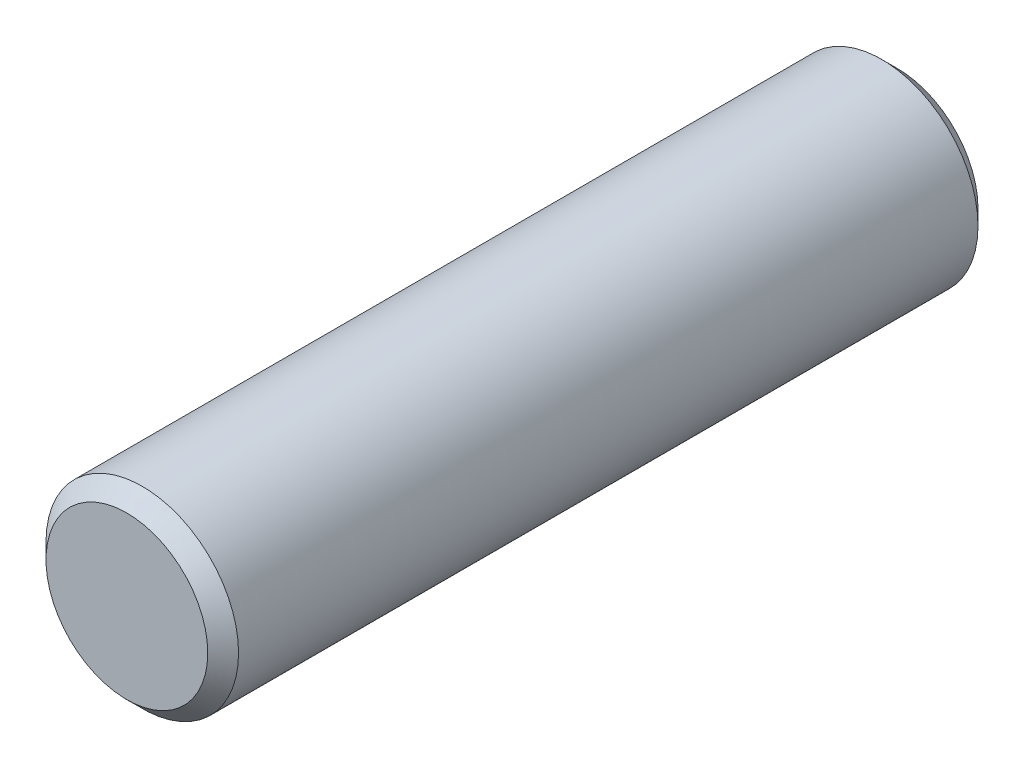
ISO-10303-21;
HEADER;
FILE_DESCRIPTION(('STEP AP214'),'2;1');
FILE_NAME('part.step','',(''),(''),'','','');
FILE_SCHEMA(('AUTOMOTIVE_DESIGN { 1 0 10303 214 1 1 1 1 }'));
ENDSEC;
DATA;
#1=APPLICATION_CONTEXT('core data for automotive mechanical design processes');
#2=APPLICATION_PROTOCOL_DEFINITION('international standard','automotive_design',2000,#1);
#3=PRODUCT_CONTEXT('',#1,'mechanical');
#4=PRODUCT('Part','Part','',(#3));
#5=PRODUCT_RELATED_PRODUCT_CATEGORY('part','',(#4));
#6=PRODUCT_DEFINITION_FORMATION('','',#4);
#7=PRODUCT_DEFINITION_CONTEXT('part definition',#1,'design');
#8=PRODUCT_DEFINITION('design','',#6,#7);
#9=PRODUCT_DEFINITION_SHAPE('','',#8);
#10=(LENGTH_UNIT() NAMED_UNIT(*) SI_UNIT(.MILLI.,.METRE.));
#11=(NAMED_UNIT(*) PLANE_ANGLE_UNIT() SI_UNIT($,.RADIAN.));
#12=(NAMED_UNIT(*) SI_UNIT($,.STERADIAN.) SOLID_ANGLE_UNIT());
#13=UNCERTAINTY_MEASURE_WITH_UNIT(LENGTH_MEASURE(1.E-05),#10,'distance_accuracy_value','');
#14=(GEOMETRIC_REPRESENTATION_CONTEXT(3) GLOBAL_UNCERTAINTY_ASSIGNED_CONTEXT((#13)) GLOBAL_UNIT_ASSIGNED_CONTEXT((#10,
#11,#12)) REPRESENTATION_CONTEXT('',''));
#15=CARTESIAN_POINT('',(0.,0.,0.));
#16=DIRECTION('',(0.,0.,1.));
#17=DIRECTION('',(1.,0.,0.));
#18=AXIS2_PLACEMENT_3D('',#15,#16,#17);
#19=CARTESIAN_POINT('',(0.,0.,20.));
#20=DIRECTION('',(0.,0.,-1.));
#21=DIRECTION('',(-1.,0.,0.));
#22=AXIS2_PLACEMENT_3D('',#19,#20,#21);
#23=CYLINDRICAL_SURFACE('',#22,2.5);
#24=CARTESIAN_POINT('',(0.,0.,0.400000000000005));
#25=DIRECTION('',(0.,0.,1.));
#26=DIRECTION('',(1.,0.,0.));
#27=AXIS2_PLACEMENT_3D('',#24,#25,#26);
#28=CIRCLE('',#27,2.5);
#29=CARTESIAN_POINT('',(2.5,0.,0.400000000000005));
#30=VERTEX_POINT('',#29);
#31=EDGE_CURVE('E63',#30,#30,#28,.T.);
#32=ORIENTED_EDGE('',*,*,#31,.T.);
#33=EDGE_LOOP('',(#32));
#34=FACE_BOUND('',#33,.T.);
#35=CARTESIAN_POINT('',(0.,0.,19.6));
#36=DIRECTION('',(0.,0.,1.));
#37=DIRECTION('',(1.,0.,0.));
#38=AXIS2_PLACEMENT_3D('',#35,#36,#37);
#39=CIRCLE('',#38,2.5);
#40=CARTESIAN_POINT('',(2.5,0.,19.6));
#41=VERTEX_POINT('',#40);
#42=EDGE_CURVE('E68',#41,#41,#39,.F.);
#43=ORIENTED_EDGE('',*,*,#42,.T.);
#44=EDGE_LOOP('',(#43));
#45=FACE_BOUND('',#44,.T.);
#46=ADVANCED_FACE('F49',(#34,#45),#23,.T.);
#47=CARTESIAN_POINT('',(0.,0.,20.));
#48=DIRECTION('',(0.,0.,1.));
#49=DIRECTION('',(1.,0.,0.));
#50=AXIS2_PLACEMENT_3D('',#47,#48,#49);
#51=PLANE('',#50);
#52=CARTESIAN_POINT('',(0.,0.,20.));
#53=DIRECTION('',(0.,0.,1.));
#54=DIRECTION('',(1.,0.,0.));
#55=AXIS2_PLACEMENT_3D('',#52,#53,#54);
#56=CIRCLE('',#55,2.1);
#57=CARTESIAN_POINT('',(2.1,0.,20.));
#58=VERTEX_POINT('',#57);
#59=EDGE_CURVE('E10',#58,#58,#56,.T.);
#60=ORIENTED_EDGE('',*,*,#59,.T.);
#61=EDGE_LOOP('',(#60));
#62=FACE_BOUND('',#61,.T.);
#63=ADVANCED_FACE('F85',(#62),#51,.T.);
#64=CARTESIAN_POINT('',(0.,0.,0.));
#65=DIRECTION('',(0.,0.,1.));
#66=DIRECTION('',(1.,0.,0.));
#67=AXIS2_PLACEMENT_3D('',#64,#65,#66);
#68=PLANE('',#67);
#69=CARTESIAN_POINT('',(0.,0.,0.));
#70=DIRECTION('',(0.,0.,1.));
#71=DIRECTION('',(1.,0.,0.));
#72=AXIS2_PLACEMENT_3D('',#69,#70,#71);
#73=CIRCLE('',#72,2.09999999999999);
#74=CARTESIAN_POINT('',(2.09999999999999,0.,0.));
#75=VERTEX_POINT('',#74);
#76=EDGE_CURVE('E58',#75,#75,#73,.F.);
#77=ORIENTED_EDGE('',*,*,#76,.T.);
#78=EDGE_LOOP('',(#77));
#79=FACE_BOUND('',#78,.T.);
#80=ADVANCED_FACE('F82',(#79),#68,.F.);
#81=CARTESIAN_POINT('',(0.,0.,0.400000000000005));
#82=DIRECTION('',(0.,0.,1.));
#83=DIRECTION('',(1.,0.,0.));
#84=AXIS2_PLACEMENT_3D('',#81,#82,#83);
#85=CONICAL_SURFACE('',#84,2.5,0.78539816339745);
#86=ORIENTED_EDGE('',*,*,#76,.F.);
#87=EDGE_LOOP('',(#86));
#88=FACE_BOUND('',#87,.T.);
#89=ORIENTED_EDGE('',*,*,#31,.F.);
#90=EDGE_LOOP('',(#89));
#91=FACE_BOUND('',#90,.T.);
#92=ADVANCED_FACE('F78',(#88,#91),#85,.T.);
#93=CARTESIAN_POINT('',(0.,0.,20.));
#94=DIRECTION('',(0.,0.,-1.));
#95=DIRECTION('',(-1.,0.,0.));
#96=AXIS2_PLACEMENT_3D('',#93,#94,#95);
#97=CONICAL_SURFACE('',#96,2.1,0.785398163397443);
#98=ORIENTED_EDGE('',*,*,#42,.F.);
#99=EDGE_LOOP('',(#98));
#100=FACE_BOUND('',#99,.T.);
#101=ORIENTED_EDGE('',*,*,#59,.F.);
#102=EDGE_LOOP('',(#101));
#103=FACE_BOUND('',#102,.T.);
#104=ADVANCED_FACE('F52',(#100,#103),#97,.T.);
#105=CLOSED_SHELL('',(#46,#63,#80,#92,#104));
#106=MANIFOLD_SOLID_BREP('B2',#105);
#107=ADVANCED_BREP_SHAPE_REPRESENTATION('',(#18,#106),#14);
#108=SHAPE_DEFINITION_REPRESENTATION(#9,#107);
ENDSEC;
END-ISO-10303-21;
